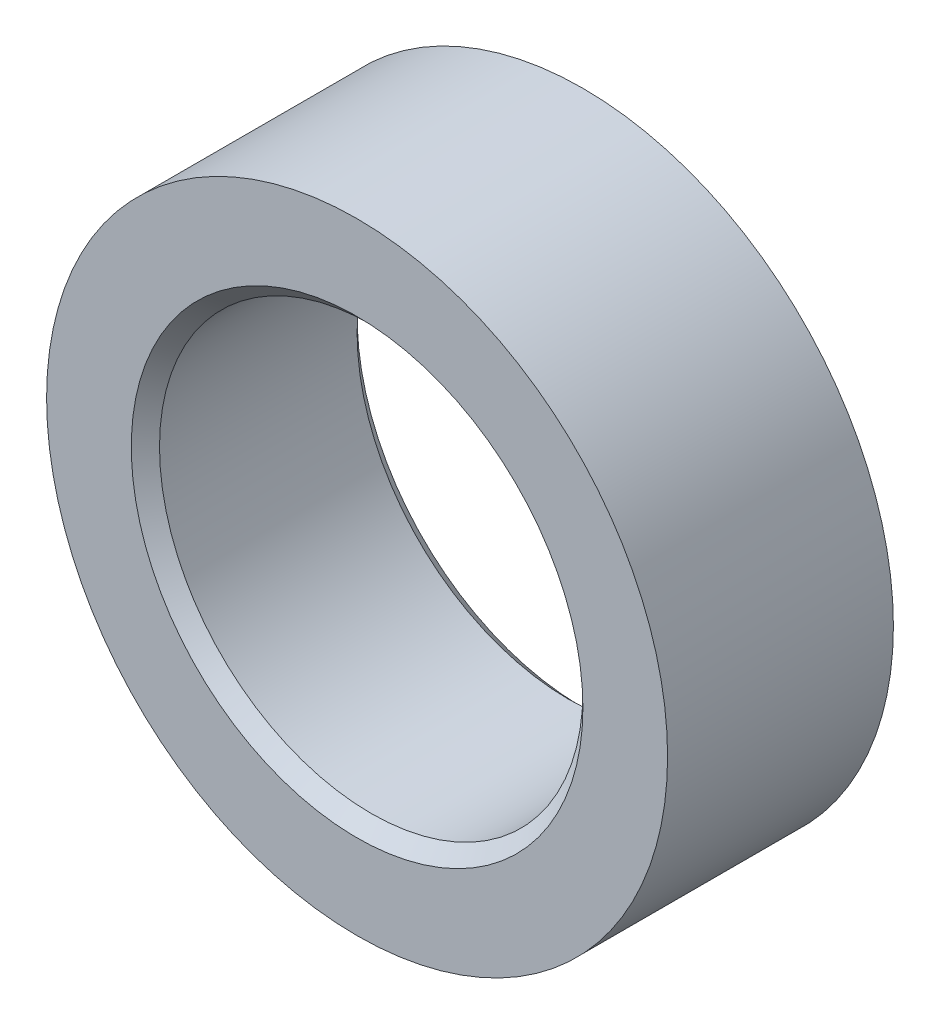
ISO-10303-21;
HEADER;
FILE_DESCRIPTION(('STEP AP214'),'2;1');
FILE_NAME('part.step','',(''),(''),'','','');
FILE_SCHEMA(('AUTOMOTIVE_DESIGN { 1 0 10303 214 1 1 1 1 }'));
ENDSEC;
DATA;
#1=APPLICATION_CONTEXT('core data for automotive mechanical design processes');
#2=APPLICATION_PROTOCOL_DEFINITION('international standard','automotive_design',2000,#1);
#3=PRODUCT_CONTEXT('',#1,'mechanical');
#4=PRODUCT('Part','Part','',(#3));
#5=PRODUCT_RELATED_PRODUCT_CATEGORY('part','',(#4));
#6=PRODUCT_DEFINITION_FORMATION('','',#4);
#7=PRODUCT_DEFINITION_CONTEXT('part definition',#1,'design');
#8=PRODUCT_DEFINITION('design','',#6,#7);
#9=PRODUCT_DEFINITION_SHAPE('','',#8);
#10=(LENGTH_UNIT() NAMED_UNIT(*) SI_UNIT(.MILLI.,.METRE.));
#11=(NAMED_UNIT(*) PLANE_ANGLE_UNIT() SI_UNIT($,.RADIAN.));
#12=(NAMED_UNIT(*) SI_UNIT($,.STERADIAN.) SOLID_ANGLE_UNIT());
#13=UNCERTAINTY_MEASURE_WITH_UNIT(LENGTH_MEASURE(1.E-05),#10,'distance_accuracy_value','');
#14=(GEOMETRIC_REPRESENTATION_CONTEXT(3) GLOBAL_UNCERTAINTY_ASSIGNED_CONTEXT((#13)) GLOBAL_UNIT_ASSIGNED_CONTEXT((#10,
#11,#12)) REPRESENTATION_CONTEXT('',''));
#15=CARTESIAN_POINT('',(0.,0.,0.));
#16=DIRECTION('',(0.,0.,1.));
#17=DIRECTION('',(1.,0.,0.));
#18=AXIS2_PLACEMENT_3D('',#15,#16,#17);
#19=CARTESIAN_POINT('',(0.,0.,4.));
#20=DIRECTION('',(0.,0.,1.));
#21=DIRECTION('',(1.,0.,0.));
#22=AXIS2_PLACEMENT_3D('',#19,#20,#21);
#23=PLANE('',#22);
#24=CARTESIAN_POINT('',(0.,0.,4.));
#25=DIRECTION('',(0.,0.,1.));
#26=DIRECTION('',(1.,0.,0.));
#27=AXIS2_PLACEMENT_3D('',#24,#25,#26);
#28=CIRCLE('',#27,8.);
#29=CARTESIAN_POINT('',(8.,0.,4.));
#30=VERTEX_POINT('',#29);
#31=EDGE_CURVE('E47',#30,#30,#28,.F.);
#32=ORIENTED_EDGE('',*,*,#31,.T.);
#33=EDGE_LOOP('',(#32));
#34=FACE_BOUND('',#33,.T.);
#35=CARTESIAN_POINT('',(0.,0.,4.));
#36=DIRECTION('',(0.,0.,1.));
#37=DIRECTION('',(1.,0.,0.));
#38=AXIS2_PLACEMENT_3D('',#35,#36,#37);
#39=CIRCLE('',#38,11.);
#40=CARTESIAN_POINT('',(11.,0.,4.));
#41=VERTEX_POINT('',#40);
#42=EDGE_CURVE('E60',#41,#41,#39,.T.);
#43=ORIENTED_EDGE('',*,*,#42,.T.);
#44=EDGE_LOOP('',(#43));
#45=FACE_BOUND('',#44,.T.);
#46=ADVANCED_FACE('F39',(#34,#45),#23,.T.);
#47=CARTESIAN_POINT('',(0.,0.,-4.));
#48=DIRECTION('',(0.,0.,1.));
#49=DIRECTION('',(1.,0.,0.));
#50=AXIS2_PLACEMENT_3D('',#47,#48,#49);
#51=PLANE('',#50);
#52=CARTESIAN_POINT('',(0.,0.,-4.));
#53=DIRECTION('',(0.,0.,1.));
#54=DIRECTION('',(1.,0.,0.));
#55=AXIS2_PLACEMENT_3D('',#52,#53,#54);
#56=CIRCLE('',#55,8.);
#57=CARTESIAN_POINT('',(8.,0.,-4.));
#58=VERTEX_POINT('',#57);
#59=EDGE_CURVE('E10',#58,#58,#56,.T.);
#60=ORIENTED_EDGE('',*,*,#59,.T.);
#61=EDGE_LOOP('',(#60));
#62=FACE_BOUND('',#61,.T.);
#63=CARTESIAN_POINT('',(0.,0.,-4.));
#64=DIRECTION('',(0.,0.,1.));
#65=DIRECTION('',(1.,0.,0.));
#66=AXIS2_PLACEMENT_3D('',#63,#64,#65);
#67=CIRCLE('',#66,11.);
#68=CARTESIAN_POINT('',(11.,0.,-4.));
#69=VERTEX_POINT('',#68);
#70=EDGE_CURVE('E61',#69,#69,#67,.T.);
#71=ORIENTED_EDGE('',*,*,#70,.F.);
#72=EDGE_LOOP('',(#71));
#73=FACE_BOUND('',#72,.T.);
#74=ADVANCED_FACE('F72',(#62,#73),#51,.F.);
#75=CARTESIAN_POINT('',(0.,0.,4.));
#76=DIRECTION('',(0.,0.,-1.));
#77=DIRECTION('',(-1.,0.,0.));
#78=AXIS2_PLACEMENT_3D('',#75,#76,#77);
#79=CYLINDRICAL_SURFACE('',#78,11.);
#80=ORIENTED_EDGE('',*,*,#42,.F.);
#81=EDGE_LOOP('',(#80));
#82=FACE_BOUND('',#81,.T.);
#83=ORIENTED_EDGE('',*,*,#70,.T.);
#84=EDGE_LOOP('',(#83));
#85=FACE_BOUND('',#84,.T.);
#86=ADVANCED_FACE('F68',(#82,#85),#79,.T.);
#87=CARTESIAN_POINT('',(0.,0.,4.));
#88=DIRECTION('',(0.,0.,-1.));
#89=DIRECTION('',(-1.,0.,0.));
#90=AXIS2_PLACEMENT_3D('',#87,#88,#89);
#91=CYLINDRICAL_SURFACE('',#90,7.5);
#92=CARTESIAN_POINT('',(0.,0.,3.5));
#93=DIRECTION('',(0.,0.,1.));
#94=DIRECTION('',(1.,0.,0.));
#95=AXIS2_PLACEMENT_3D('',#92,#93,#94);
#96=CIRCLE('',#95,7.5);
#97=CARTESIAN_POINT('',(7.5,0.,3.5));
#98=VERTEX_POINT('',#97);
#99=EDGE_CURVE('E51',#98,#98,#96,.T.);
#100=ORIENTED_EDGE('',*,*,#99,.T.);
#101=EDGE_LOOP('',(#100));
#102=FACE_BOUND('',#101,.T.);
#103=CARTESIAN_POINT('',(0.,0.,-3.5));
#104=DIRECTION('',(0.,0.,1.));
#105=DIRECTION('',(1.,0.,0.));
#106=AXIS2_PLACEMENT_3D('',#103,#104,#105);
#107=CIRCLE('',#106,7.5);
#108=CARTESIAN_POINT('',(7.5,0.,-3.5));
#109=VERTEX_POINT('',#108);
#110=EDGE_CURVE('E55',#109,#109,#107,.F.);
#111=ORIENTED_EDGE('',*,*,#110,.T.);
#112=EDGE_LOOP('',(#111));
#113=FACE_BOUND('',#112,.T.);
#114=ADVANCED_FACE('F71',(#102,#113),#91,.F.);
#115=CARTESIAN_POINT('',(0.,0.,3.5));
#116=DIRECTION('',(0.,0.,1.));
#117=DIRECTION('',(1.,0.,0.));
#118=AXIS2_PLACEMENT_3D('',#115,#116,#117);
#119=CONICAL_SURFACE('',#118,7.5,0.785398163397453);
#120=ORIENTED_EDGE('',*,*,#31,.F.);
#121=EDGE_LOOP('',(#120));
#122=FACE_BOUND('',#121,.T.);
#123=ORIENTED_EDGE('',*,*,#99,.F.);
#124=EDGE_LOOP('',(#123));
#125=FACE_BOUND('',#124,.T.);
#126=ADVANCED_FACE('F85',(#122,#125),#119,.F.);
#127=CARTESIAN_POINT('',(0.,0.,-4.));
#128=DIRECTION('',(0.,0.,-1.));
#129=DIRECTION('',(-1.,0.,0.));
#130=AXIS2_PLACEMENT_3D('',#127,#128,#129);
#131=CONICAL_SURFACE('',#130,8.,0.785398163397445);
#132=ORIENTED_EDGE('',*,*,#110,.F.);
#133=EDGE_LOOP('',(#132));
#134=FACE_BOUND('',#133,.T.);
#135=ORIENTED_EDGE('',*,*,#59,.F.);
#136=EDGE_LOOP('',(#135));
#137=FACE_BOUND('',#136,.T.);
#138=ADVANCED_FACE('F42',(#134,#137),#131,.F.);
#139=CLOSED_SHELL('',(#46,#74,#86,#114,#126,#138));
#140=MANIFOLD_SOLID_BREP('B2',#139);
#141=ADVANCED_BREP_SHAPE_REPRESENTATION('',(#18,#140),#14);
#142=SHAPE_DEFINITION_REPRESENTATION(#9,#141);
ENDSEC;
END-ISO-10303-21;
